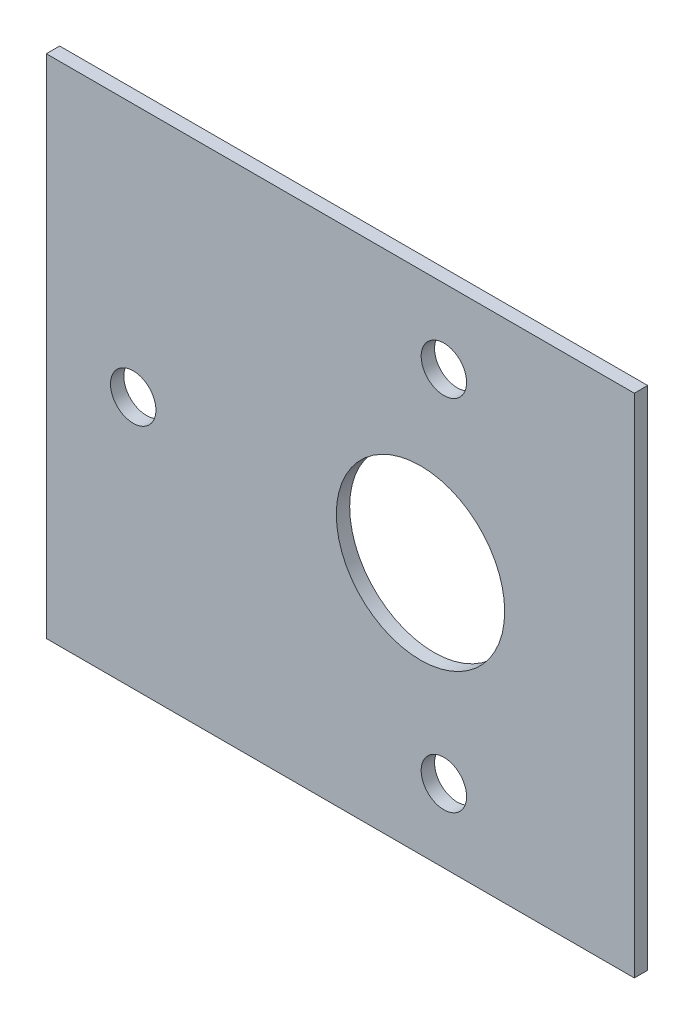
ISO-10303-21;
HEADER;
FILE_DESCRIPTION(('STEP AP214'),'2;1');
FILE_NAME('part.step','',(''),(''),'','','');
FILE_SCHEMA(('AUTOMOTIVE_DESIGN { 1 0 10303 214 1 1 1 1 }'));
ENDSEC;
DATA;
#1=APPLICATION_CONTEXT('core data for automotive mechanical design processes');
#2=APPLICATION_PROTOCOL_DEFINITION('international standard','automotive_design',2000,#1);
#3=PRODUCT_CONTEXT('',#1,'mechanical');
#4=PRODUCT('Part','Part','',(#3));
#5=PRODUCT_RELATED_PRODUCT_CATEGORY('part','',(#4));
#6=PRODUCT_DEFINITION_FORMATION('','',#4);
#7=PRODUCT_DEFINITION_CONTEXT('part definition',#1,'design');
#8=PRODUCT_DEFINITION('design','',#6,#7);
#9=PRODUCT_DEFINITION_SHAPE('','',#8);
#10=(LENGTH_UNIT() NAMED_UNIT(*) SI_UNIT(.MILLI.,.METRE.));
#11=(NAMED_UNIT(*) PLANE_ANGLE_UNIT() SI_UNIT($,.RADIAN.));
#12=(NAMED_UNIT(*) SI_UNIT($,.STERADIAN.) SOLID_ANGLE_UNIT());
#13=UNCERTAINTY_MEASURE_WITH_UNIT(LENGTH_MEASURE(1.E-05),#10,'distance_accuracy_value','');
#14=(GEOMETRIC_REPRESENTATION_CONTEXT(3) GLOBAL_UNCERTAINTY_ASSIGNED_CONTEXT((#13)) GLOBAL_UNIT_ASSIGNED_CONTEXT((#10,
#11,#12)) REPRESENTATION_CONTEXT('',''));
#15=CARTESIAN_POINT('',(0.,0.,0.));
#16=DIRECTION('',(0.,0.,1.));
#17=DIRECTION('',(1.,0.,0.));
#18=AXIS2_PLACEMENT_3D('',#15,#16,#17);
#19=CARTESIAN_POINT('',(1.75,41.923393758659,-1.));
#20=DIRECTION('',(0.,0.,1.));
#21=DIRECTION('',(1.,0.,0.));
#22=AXIS2_PLACEMENT_3D('',#19,#20,#21);
#23=CYLINDRICAL_SURFACE('',#22,1.7);
#24=CARTESIAN_POINT('',(1.75,41.923393758659,1.));
#25=DIRECTION('',(0.,0.,1.));
#26=DIRECTION('',(1.,0.,0.));
#27=AXIS2_PLACEMENT_3D('',#24,#25,#26);
#28=CIRCLE('',#27,1.7);
#29=CARTESIAN_POINT('',(3.45,41.923393758659,1.));
#30=VERTEX_POINT('',#29);
#31=EDGE_CURVE('E100',#30,#30,#28,.T.);
#32=ORIENTED_EDGE('',*,*,#31,.T.);
#33=EDGE_LOOP('',(#32));
#34=FACE_BOUND('',#33,.T.);
#35=CARTESIAN_POINT('',(1.75,41.923393758659,0.));
#36=DIRECTION('',(0.,0.,1.));
#37=DIRECTION('',(1.,0.,0.));
#38=AXIS2_PLACEMENT_3D('',#35,#36,#37);
#39=CIRCLE('',#38,1.7);
#40=CARTESIAN_POINT('',(3.45,41.923393758659,0.));
#41=VERTEX_POINT('',#40);
#42=EDGE_CURVE('E11',#41,#41,#39,.T.);
#43=ORIENTED_EDGE('',*,*,#42,.F.);
#44=EDGE_LOOP('',(#43));
#45=FACE_BOUND('',#44,.T.);
#46=ADVANCED_FACE('F17',(#34,#45),#23,.F.);
#47=CARTESIAN_POINT('',(0.,28.5,-1.));
#48=DIRECTION('',(0.,0.,1.));
#49=DIRECTION('',(1.,0.,0.));
#50=AXIS2_PLACEMENT_3D('',#47,#48,#49);
#51=CYLINDRICAL_SURFACE('',#50,6.3);
#52=CARTESIAN_POINT('',(0.,28.5,1.));
#53=DIRECTION('',(0.,0.,1.));
#54=DIRECTION('',(1.,0.,0.));
#55=AXIS2_PLACEMENT_3D('',#52,#53,#54);
#56=CIRCLE('',#55,6.3);
#57=CARTESIAN_POINT('',(6.3,28.5,1.));
#58=VERTEX_POINT('',#57);
#59=EDGE_CURVE('E104',#58,#58,#56,.T.);
#60=ORIENTED_EDGE('',*,*,#59,.T.);
#61=EDGE_LOOP('',(#60));
#62=FACE_BOUND('',#61,.T.);
#63=CARTESIAN_POINT('',(0.,28.5,0.));
#64=DIRECTION('',(0.,0.,1.));
#65=DIRECTION('',(1.,0.,0.));
#66=AXIS2_PLACEMENT_3D('',#63,#64,#65);
#67=CIRCLE('',#66,6.3);
#68=CARTESIAN_POINT('',(6.3,28.5,0.));
#69=VERTEX_POINT('',#68);
#70=EDGE_CURVE('E20',#69,#69,#67,.T.);
#71=ORIENTED_EDGE('',*,*,#70,.F.);
#72=EDGE_LOOP('',(#71));
#73=FACE_BOUND('',#72,.T.);
#74=ADVANCED_FACE('F179',(#62,#73),#51,.F.);
#75=CARTESIAN_POINT('',(-21.5,28.5,-1.));
#76=DIRECTION('',(0.,0.,1.));
#77=DIRECTION('',(1.,0.,0.));
#78=AXIS2_PLACEMENT_3D('',#75,#76,#77);
#79=CYLINDRICAL_SURFACE('',#78,1.7);
#80=CARTESIAN_POINT('',(-21.5,28.5,1.));
#81=DIRECTION('',(0.,0.,1.));
#82=DIRECTION('',(1.,0.,0.));
#83=AXIS2_PLACEMENT_3D('',#80,#81,#82);
#84=CIRCLE('',#83,1.7);
#85=CARTESIAN_POINT('',(-19.8,28.5,1.));
#86=VERTEX_POINT('',#85);
#87=EDGE_CURVE('E102',#86,#86,#84,.T.);
#88=ORIENTED_EDGE('',*,*,#87,.T.);
#89=EDGE_LOOP('',(#88));
#90=FACE_BOUND('',#89,.T.);
#91=CARTESIAN_POINT('',(-21.5,28.5,0.));
#92=DIRECTION('',(0.,0.,1.));
#93=DIRECTION('',(1.,0.,0.));
#94=AXIS2_PLACEMENT_3D('',#91,#92,#93);
#95=CIRCLE('',#94,1.7);
#96=CARTESIAN_POINT('',(-19.8,28.5,0.));
#97=VERTEX_POINT('',#96);
#98=EDGE_CURVE('E121',#97,#97,#95,.T.);
#99=ORIENTED_EDGE('',*,*,#98,.F.);
#100=EDGE_LOOP('',(#99));
#101=FACE_BOUND('',#100,.T.);
#102=ADVANCED_FACE('F170',(#90,#101),#79,.F.);
#103=CARTESIAN_POINT('',(1.75,15.076606241341,-1.));
#104=DIRECTION('',(0.,0.,1.));
#105=DIRECTION('',(1.,0.,0.));
#106=AXIS2_PLACEMENT_3D('',#103,#104,#105);
#107=CYLINDRICAL_SURFACE('',#106,1.7);
#108=CARTESIAN_POINT('',(1.75,15.076606241341,1.));
#109=DIRECTION('',(0.,0.,1.));
#110=DIRECTION('',(1.,0.,0.));
#111=AXIS2_PLACEMENT_3D('',#108,#109,#110);
#112=CIRCLE('',#111,1.7);
#113=CARTESIAN_POINT('',(3.45,15.076606241341,1.));
#114=VERTEX_POINT('',#113);
#115=EDGE_CURVE('E105',#114,#114,#112,.T.);
#116=ORIENTED_EDGE('',*,*,#115,.T.);
#117=EDGE_LOOP('',(#116));
#118=FACE_BOUND('',#117,.T.);
#119=CARTESIAN_POINT('',(1.75,15.076606241341,0.));
#120=DIRECTION('',(0.,0.,1.));
#121=DIRECTION('',(1.,0.,0.));
#122=AXIS2_PLACEMENT_3D('',#119,#120,#121);
#123=CIRCLE('',#122,1.7);
#124=CARTESIAN_POINT('',(3.45,15.076606241341,0.));
#125=VERTEX_POINT('',#124);
#126=EDGE_CURVE('E111',#125,#125,#123,.T.);
#127=ORIENTED_EDGE('',*,*,#126,.F.);
#128=EDGE_LOOP('',(#127));
#129=FACE_BOUND('',#128,.T.);
#130=ADVANCED_FACE('F167',(#118,#129),#107,.F.);
#131=CARTESIAN_POINT('',(16.,9.6,0.));
#132=DIRECTION('',(1.,0.,0.));
#133=DIRECTION('',(0.,1.,0.));
#134=AXIS2_PLACEMENT_3D('',#131,#132,#133);
#135=PLANE('',#134);
#136=DIRECTION('',(0.,0.,1.));
#137=VECTOR('',#136,1.);
#138=CARTESIAN_POINT('',(16.,9.6,0.));
#139=LINE('',#138,#137);
#140=CARTESIAN_POINT('',(16.,9.6,0.));
#141=VERTEX_POINT('',#140);
#142=CARTESIAN_POINT('',(16.,9.6,1.));
#143=VERTEX_POINT('',#142);
#144=EDGE_CURVE('E69',#141,#143,#139,.T.);
#145=ORIENTED_EDGE('',*,*,#144,.F.);
#146=DIRECTION('',(0.,1.,0.));
#147=VECTOR('',#146,1.);
#148=CARTESIAN_POINT('',(16.,9.6,0.));
#149=LINE('',#148,#147);
#150=CARTESIAN_POINT('',(16.,47.5,0.));
#151=VERTEX_POINT('',#150);
#152=EDGE_CURVE('E39',#141,#151,#149,.T.);
#153=ORIENTED_EDGE('',*,*,#152,.T.);
#154=DIRECTION('',(0.,0.,1.));
#155=VECTOR('',#154,1.);
#156=CARTESIAN_POINT('',(16.,47.5,0.));
#157=LINE('',#156,#155);
#158=CARTESIAN_POINT('',(16.,47.5,1.));
#159=VERTEX_POINT('',#158);
#160=EDGE_CURVE('E70',#151,#159,#157,.T.);
#161=ORIENTED_EDGE('',*,*,#160,.T.);
#162=DIRECTION('',(0.,1.,0.));
#163=VECTOR('',#162,1.);
#164=CARTESIAN_POINT('',(16.,9.6,1.));
#165=LINE('',#164,#163);
#166=EDGE_CURVE('E65',#143,#159,#165,.T.);
#167=ORIENTED_EDGE('',*,*,#166,.F.);
#168=EDGE_LOOP('',(#145,#153,#161,#167));
#169=FACE_BOUND('',#168,.T.);
#170=ADVANCED_FACE('F67',(#169),#135,.T.);
#171=CARTESIAN_POINT('',(-28.,9.6,0.));
#172=DIRECTION('',(0.,0.,1.));
#173=DIRECTION('',(1.,0.,0.));
#174=AXIS2_PLACEMENT_3D('',#171,#172,#173);
#175=PLANE('',#174);
#176=ORIENTED_EDGE('',*,*,#42,.T.);
#177=EDGE_LOOP('',(#176));
#178=FACE_BOUND('',#177,.T.);
#179=ORIENTED_EDGE('',*,*,#70,.T.);
#180=EDGE_LOOP('',(#179));
#181=FACE_BOUND('',#180,.T.);
#182=ORIENTED_EDGE('',*,*,#98,.T.);
#183=EDGE_LOOP('',(#182));
#184=FACE_BOUND('',#183,.T.);
#185=ORIENTED_EDGE('',*,*,#126,.T.);
#186=EDGE_LOOP('',(#185));
#187=FACE_BOUND('',#186,.T.);
#188=DIRECTION('',(1.,0.,0.));
#189=VECTOR('',#188,1.);
#190=CARTESIAN_POINT('',(-28.,47.5,0.));
#191=LINE('',#190,#189);
#192=CARTESIAN_POINT('',(-28.,47.5,0.));
#193=VERTEX_POINT('',#192);
#194=EDGE_CURVE('E118',#193,#151,#191,.T.);
#195=ORIENTED_EDGE('',*,*,#194,.T.);
#196=ORIENTED_EDGE('',*,*,#152,.F.);
#197=DIRECTION('',(1.,0.,0.));
#198=VECTOR('',#197,1.);
#199=CARTESIAN_POINT('',(-28.,9.6,0.));
#200=LINE('',#199,#198);
#201=CARTESIAN_POINT('',(-28.,9.6,0.));
#202=VERTEX_POINT('',#201);
#203=EDGE_CURVE('E75',#202,#141,#200,.T.);
#204=ORIENTED_EDGE('',*,*,#203,.F.);
#205=DIRECTION('',(0.,1.,0.));
#206=VECTOR('',#205,1.);
#207=CARTESIAN_POINT('',(-28.,9.6,0.));
#208=LINE('',#207,#206);
#209=EDGE_CURVE('E96',#202,#193,#208,.T.);
#210=ORIENTED_EDGE('',*,*,#209,.T.);
#211=EDGE_LOOP('',(#195,#196,#204,#210));
#212=FACE_BOUND('',#211,.T.);
#213=ADVANCED_FACE('F177',(#178,#181,#184,#187,#212),#175,.F.);
#214=CARTESIAN_POINT('',(-28.,47.5,0.));
#215=DIRECTION('',(0.,1.,0.));
#216=DIRECTION('',(1.,0.,0.));
#217=AXIS2_PLACEMENT_3D('',#214,#215,#216);
#218=PLANE('',#217);
#219=ORIENTED_EDGE('',*,*,#194,.F.);
#220=DIRECTION('',(0.,0.,1.));
#221=VECTOR('',#220,1.);
#222=CARTESIAN_POINT('',(-28.,47.5,0.));
#223=LINE('',#222,#221);
#224=CARTESIAN_POINT('',(-28.,47.5,1.));
#225=VERTEX_POINT('',#224);
#226=EDGE_CURVE('E137',#193,#225,#223,.T.);
#227=ORIENTED_EDGE('',*,*,#226,.T.);
#228=DIRECTION('',(1.,0.,0.));
#229=VECTOR('',#228,1.);
#230=CARTESIAN_POINT('',(-28.,47.5,1.));
#231=LINE('',#230,#229);
#232=EDGE_CURVE('E74',#225,#159,#231,.T.);
#233=ORIENTED_EDGE('',*,*,#232,.T.);
#234=ORIENTED_EDGE('',*,*,#160,.F.);
#235=EDGE_LOOP('',(#219,#227,#233,#234));
#236=FACE_BOUND('',#235,.T.);
#237=ADVANCED_FACE('F159',(#236),#218,.T.);
#238=CARTESIAN_POINT('',(-28.,9.6,1.));
#239=DIRECTION('',(0.,0.,1.));
#240=DIRECTION('',(1.,0.,0.));
#241=AXIS2_PLACEMENT_3D('',#238,#239,#240);
#242=PLANE('',#241);
#243=ORIENTED_EDGE('',*,*,#31,.F.);
#244=EDGE_LOOP('',(#243));
#245=FACE_BOUND('',#244,.T.);
#246=ORIENTED_EDGE('',*,*,#59,.F.);
#247=EDGE_LOOP('',(#246));
#248=FACE_BOUND('',#247,.T.);
#249=ORIENTED_EDGE('',*,*,#87,.F.);
#250=EDGE_LOOP('',(#249));
#251=FACE_BOUND('',#250,.T.);
#252=ORIENTED_EDGE('',*,*,#115,.F.);
#253=EDGE_LOOP('',(#252));
#254=FACE_BOUND('',#253,.T.);
#255=DIRECTION('',(0.,1.,0.));
#256=VECTOR('',#255,1.);
#257=CARTESIAN_POINT('',(-28.,9.6,1.));
#258=LINE('',#257,#256);
#259=CARTESIAN_POINT('',(-28.,9.6,1.));
#260=VERTEX_POINT('',#259);
#261=EDGE_CURVE('E81',#260,#225,#258,.T.);
#262=ORIENTED_EDGE('',*,*,#261,.F.);
#263=DIRECTION('',(1.,0.,0.));
#264=VECTOR('',#263,1.);
#265=CARTESIAN_POINT('',(-28.,9.6,1.));
#266=LINE('',#265,#264);
#267=EDGE_CURVE('E78',#260,#143,#266,.T.);
#268=ORIENTED_EDGE('',*,*,#267,.T.);
#269=ORIENTED_EDGE('',*,*,#166,.T.);
#270=ORIENTED_EDGE('',*,*,#232,.F.);
#271=EDGE_LOOP('',(#262,#268,#269,#270));
#272=FACE_BOUND('',#271,.T.);
#273=ADVANCED_FACE('F79',(#245,#248,#251,#254,#272),#242,.T.);
#274=CARTESIAN_POINT('',(-28.,9.6,0.));
#275=DIRECTION('',(0.,1.,0.));
#276=DIRECTION('',(1.,0.,0.));
#277=AXIS2_PLACEMENT_3D('',#274,#275,#276);
#278=PLANE('',#277);
#279=ORIENTED_EDGE('',*,*,#144,.T.);
#280=ORIENTED_EDGE('',*,*,#267,.F.);
#281=DIRECTION('',(0.,0.,1.));
#282=VECTOR('',#281,1.);
#283=CARTESIAN_POINT('',(-28.,9.6,0.));
#284=LINE('',#283,#282);
#285=EDGE_CURVE('E90',#202,#260,#284,.T.);
#286=ORIENTED_EDGE('',*,*,#285,.F.);
#287=ORIENTED_EDGE('',*,*,#203,.T.);
#288=EDGE_LOOP('',(#279,#280,#286,#287));
#289=FACE_BOUND('',#288,.T.);
#290=ADVANCED_FACE('F88',(#289),#278,.F.);
#291=CARTESIAN_POINT('',(-28.,9.6,0.));
#292=DIRECTION('',(1.,0.,0.));
#293=DIRECTION('',(0.,1.,0.));
#294=AXIS2_PLACEMENT_3D('',#291,#292,#293);
#295=PLANE('',#294);
#296=ORIENTED_EDGE('',*,*,#261,.T.);
#297=ORIENTED_EDGE('',*,*,#226,.F.);
#298=ORIENTED_EDGE('',*,*,#209,.F.);
#299=ORIENTED_EDGE('',*,*,#285,.T.);
#300=EDGE_LOOP('',(#296,#297,#298,#299));
#301=FACE_BOUND('',#300,.T.);
#302=ADVANCED_FACE('F201',(#301),#295,.F.);
#303=CLOSED_SHELL('',(#46,#74,#102,#130,#170,#213,#237,#273,#290,#302));
#304=MANIFOLD_SOLID_BREP('B1',#303);
#305=ADVANCED_BREP_SHAPE_REPRESENTATION('',(#18,#304),#14);
#306=SHAPE_DEFINITION_REPRESENTATION(#9,#305);
ENDSEC;
END-ISO-10303-21;
